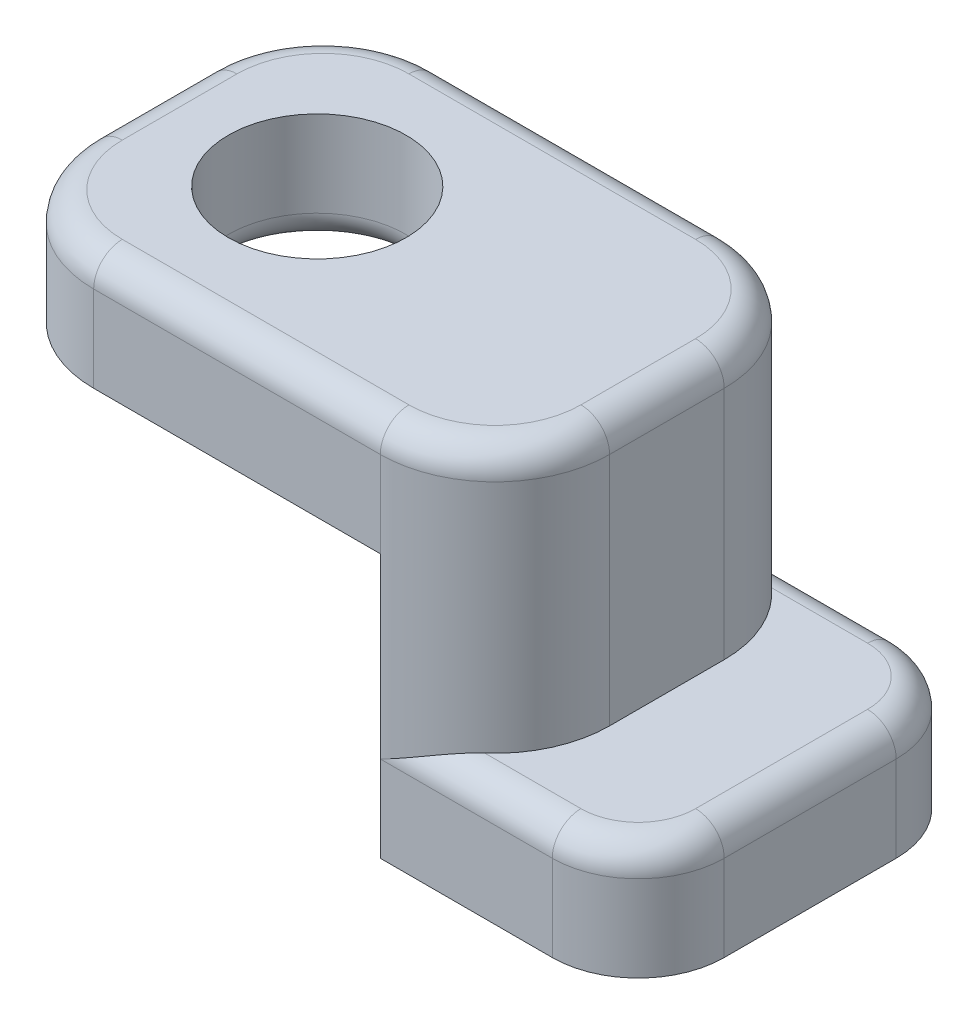
ISO-10303-21;
HEADER;
FILE_DESCRIPTION(('STEP AP214'),'2;1');
FILE_NAME('part.step','',(''),(''),'','','');
FILE_SCHEMA(('AUTOMOTIVE_DESIGN { 1 0 10303 214 1 1 1 1 }'));
ENDSEC;
DATA;
#1=APPLICATION_CONTEXT('core data for automotive mechanical design processes');
#2=APPLICATION_PROTOCOL_DEFINITION('international standard','automotive_design',2000,#1);
#3=PRODUCT_CONTEXT('',#1,'mechanical');
#4=PRODUCT('Part','Part','',(#3));
#5=PRODUCT_RELATED_PRODUCT_CATEGORY('part','',(#4));
#6=PRODUCT_DEFINITION_FORMATION('','',#4);
#7=PRODUCT_DEFINITION_CONTEXT('part definition',#1,'design');
#8=PRODUCT_DEFINITION('design','',#6,#7);
#9=PRODUCT_DEFINITION_SHAPE('','',#8);
#10=(LENGTH_UNIT() NAMED_UNIT(*) SI_UNIT(.MILLI.,.METRE.));
#11=(NAMED_UNIT(*) PLANE_ANGLE_UNIT() SI_UNIT($,.RADIAN.));
#12=(NAMED_UNIT(*) SI_UNIT($,.STERADIAN.) SOLID_ANGLE_UNIT());
#13=UNCERTAINTY_MEASURE_WITH_UNIT(LENGTH_MEASURE(1.E-05),#10,'distance_accuracy_value','');
#14=(GEOMETRIC_REPRESENTATION_CONTEXT(3) GLOBAL_UNCERTAINTY_ASSIGNED_CONTEXT((#13)) GLOBAL_UNIT_ASSIGNED_CONTEXT((#10,
#11,#12)) REPRESENTATION_CONTEXT('',''));
#15=CARTESIAN_POINT('',(0.,0.,0.));
#16=DIRECTION('',(0.,0.,1.));
#17=DIRECTION('',(1.,0.,0.));
#18=AXIS2_PLACEMENT_3D('',#15,#16,#17);
#19=CARTESIAN_POINT('',(2.5,2.,1.));
#20=DIRECTION('',(0.,-1.,0.));
#21=DIRECTION('',(0.,0.,-1.));
#22=AXIS2_PLACEMENT_3D('',#19,#20,#21);
#23=CYLINDRICAL_SURFACE('',#22,2.);
#24=DIRECTION('',(0.,-1.,0.));
#25=VECTOR('',#24,1.);
#26=CARTESIAN_POINT('',(4.5,2.,1.));
#27=LINE('',#26,#25);
#28=CARTESIAN_POINT('',(4.5,1.5,1.));
#29=VERTEX_POINT('',#28);
#30=CARTESIAN_POINT('',(4.5,-2.6,1.));
#31=VERTEX_POINT('',#30);
#32=EDGE_CURVE('E186',#29,#31,#27,.T.);
#33=ORIENTED_EDGE('',*,*,#32,.F.);
#34=CARTESIAN_POINT('',(2.5,1.5,1.));
#35=DIRECTION('',(0.,1.,0.));
#36=DIRECTION('',(0.,0.,1.));
#37=AXIS2_PLACEMENT_3D('',#34,#35,#36);
#38=CIRCLE('',#37,2.);
#39=CARTESIAN_POINT('',(2.5,1.5,3.));
#40=VERTEX_POINT('',#39);
#41=EDGE_CURVE('E295',#29,#40,#38,.F.);
#42=ORIENTED_EDGE('',*,*,#41,.T.);
#43=DIRECTION('',(0.,-1.,0.));
#44=VECTOR('',#43,1.);
#45=CARTESIAN_POINT('',(2.5,2.,3.));
#46=LINE('',#45,#44);
#47=CARTESIAN_POINT('',(2.5,0.,3.));
#48=VERTEX_POINT('',#47);
#49=EDGE_CURVE('E197',#40,#48,#46,.T.);
#50=ORIENTED_EDGE('',*,*,#49,.T.);
#51=DIRECTION('',(0.,1.,0.));
#52=VECTOR('',#51,1.);
#53=CARTESIAN_POINT('',(2.5,-4.6,3.));
#54=LINE('',#53,#52);
#55=CARTESIAN_POINT('',(2.5,-3.1,3.));
#56=VERTEX_POINT('',#55);
#57=EDGE_CURVE('E244',#56,#48,#54,.T.);
#58=ORIENTED_EDGE('',*,*,#57,.F.);
#59=CARTESIAN_POINT('',(3.82287565553229,-2.6,2.5));
#60=CARTESIAN_POINT('',(3.7984527541929,-2.60001041146748,2.52154355257096));
#61=CARTESIAN_POINT('',(3.77353061636778,-2.60139028328963,2.54245741418274));
#62=CARTESIAN_POINT('',(3.72289254665397,-2.60649832439411,2.58290199026406));
#63=CARTESIAN_POINT('',(3.69717822868773,-2.61022198524383,2.60243528029809));
#64=CARTESIAN_POINT('',(3.61944495996465,-2.6242553324765,2.65858499657073));
#65=CARTESIAN_POINT('',(3.56642280728998,-2.63744074350753,2.69311337358856));
#66=CARTESIAN_POINT('',(3.47062269700943,-2.66574389704176,2.74936132710876));
#67=CARTESIAN_POINT('',(3.42817149449629,-2.67978997791442,2.77222504946673));
#68=CARTESIAN_POINT('',(3.34248092653229,-2.71044334270582,2.81452696356911));
#69=CARTESIAN_POINT('',(3.29924124336696,-2.7270516801234,2.83396373921229));
#70=CARTESIAN_POINT('',(3.16825897389752,-2.77994999938814,2.8874197971662));
#71=CARTESIAN_POINT('',(3.07961086885532,-2.819197759605,2.916378213666));
#72=CARTESIAN_POINT('',(2.91050160700485,-2.89762139815224,2.95915616529427));
#73=CARTESIAN_POINT('',(2.83014737071499,-2.93638060742813,2.97423652527798));
#74=CARTESIAN_POINT('',(2.66917377258241,-3.01543353741682,2.99447592235285));
#75=CARTESIAN_POINT('',(2.58855573090319,-3.05572278625227,2.99966189728329));
#76=CARTESIAN_POINT('',(2.50533326775842,-3.09733336930444,2.9999946628835));
#77=CARTESIAN_POINT('',(2.50266659422678,-3.09866670626949,2.99999999557329));
#78=CARTESIAN_POINT('',(2.5,-3.1,3.));
#79=B_SPLINE_CURVE_WITH_KNOTS('',3,(#59,#60,#61,#62,#63,#64,#65,#66,#67,#68,#69,#70,#71,#72,#73,
#74,#75,#76,#77,#78),.UNSPECIFIED.,.F.,.F.,(4,2,2,2,2,2,2,2,2,4),(0.,0.0975966634311908,
0.19500616458057,0.388196470326694,0.53867609384178,0.689217754352703,0.99157284467503,
1.26249642313569,1.53268134341627,1.54162562963826),.UNSPECIFIED.);
#80=CARTESIAN_POINT('',(3.82287565553229,-2.6,2.5));
#81=VERTEX_POINT('',#80);
#82=EDGE_CURVE('E13',#56,#81,#79,.F.);
#83=ORIENTED_EDGE('',*,*,#82,.T.);
#84=CARTESIAN_POINT('',(2.5,-2.6,1.));
#85=DIRECTION('',(0.,1.,0.));
#86=DIRECTION('',(0.,0.,-1.));
#87=AXIS2_PLACEMENT_3D('',#84,#85,#86);
#88=CIRCLE('',#87,2.);
#89=EDGE_CURVE('E201',#81,#31,#88,.T.);
#90=ORIENTED_EDGE('',*,*,#89,.T.);
#91=EDGE_LOOP('',(#33,#42,#50,#58,#83,#90));
#92=FACE_BOUND('',#91,.T.);
#93=ADVANCED_FACE('F45',(#92),#23,.T.);
#94=CARTESIAN_POINT('',(4.5,2.,-1.));
#95=DIRECTION('',(-1.,0.,0.));
#96=DIRECTION('',(0.,0.,1.));
#97=AXIS2_PLACEMENT_3D('',#94,#95,#96);
#98=PLANE('',#97);
#99=DIRECTION('',(0.,-1.,0.));
#100=VECTOR('',#99,1.);
#101=CARTESIAN_POINT('',(4.5,2.,-1.));
#102=LINE('',#101,#100);
#103=CARTESIAN_POINT('',(4.5,1.5,-1.));
#104=VERTEX_POINT('',#103);
#105=CARTESIAN_POINT('',(4.5,-2.6,-1.));
#106=VERTEX_POINT('',#105);
#107=EDGE_CURVE('E198',#104,#106,#102,.T.);
#108=ORIENTED_EDGE('',*,*,#107,.F.);
#109=DIRECTION('',(0.,0.,-1.));
#110=VECTOR('',#109,1.);
#111=CARTESIAN_POINT('',(4.5,1.5,1.));
#112=LINE('',#111,#110);
#113=EDGE_CURVE('E193',#104,#29,#112,.F.);
#114=ORIENTED_EDGE('',*,*,#113,.T.);
#115=ORIENTED_EDGE('',*,*,#32,.T.);
#116=DIRECTION('',(0.,0.,-1.));
#117=VECTOR('',#116,1.);
#118=CARTESIAN_POINT('',(4.5,-2.6,1.));
#119=LINE('',#118,#117);
#120=EDGE_CURVE('E191',#31,#106,#119,.T.);
#121=ORIENTED_EDGE('',*,*,#120,.T.);
#122=EDGE_LOOP('',(#108,#114,#115,#121));
#123=FACE_BOUND('',#122,.T.);
#124=ADVANCED_FACE('F189',(#123),#98,.F.);
#125=CARTESIAN_POINT('',(2.5,2.,-1.));
#126=DIRECTION('',(0.,-1.,0.));
#127=DIRECTION('',(0.,0.,-1.));
#128=AXIS2_PLACEMENT_3D('',#125,#126,#127);
#129=CYLINDRICAL_SURFACE('',#128,2.);
#130=DIRECTION('',(0.,-1.,0.));
#131=VECTOR('',#130,1.);
#132=CARTESIAN_POINT('',(2.5,2.,-3.));
#133=LINE('',#132,#131);
#134=CARTESIAN_POINT('',(2.5,1.5,-3.));
#135=VERTEX_POINT('',#134);
#136=CARTESIAN_POINT('',(2.5,0.,-3.));
#137=VERTEX_POINT('',#136);
#138=EDGE_CURVE('E268',#135,#137,#133,.T.);
#139=ORIENTED_EDGE('',*,*,#138,.F.);
#140=CARTESIAN_POINT('',(2.5,1.5,-1.));
#141=DIRECTION('',(0.,1.,0.));
#142=DIRECTION('',(0.,0.,1.));
#143=AXIS2_PLACEMENT_3D('',#140,#141,#142);
#144=CIRCLE('',#143,2.);
#145=EDGE_CURVE('E307',#135,#104,#144,.F.);
#146=ORIENTED_EDGE('',*,*,#145,.T.);
#147=ORIENTED_EDGE('',*,*,#107,.T.);
#148=CARTESIAN_POINT('',(2.5,-2.6,-1.));
#149=DIRECTION('',(0.,1.,0.));
#150=DIRECTION('',(0.,0.,-1.));
#151=AXIS2_PLACEMENT_3D('',#148,#149,#150);
#152=CIRCLE('',#151,2.);
#153=CARTESIAN_POINT('',(3.82287565553229,-2.6,-2.5));
#154=VERTEX_POINT('',#153);
#155=EDGE_CURVE('E206',#106,#154,#152,.T.);
#156=ORIENTED_EDGE('',*,*,#155,.T.);
#157=CARTESIAN_POINT('',(3.82287565553229,-2.6,-2.5));
#158=CARTESIAN_POINT('',(3.7984527541929,-2.60001041146748,-2.52154355257096));
#159=CARTESIAN_POINT('',(3.77353061636778,-2.60139028328963,-2.54245741418274));
#160=CARTESIAN_POINT('',(3.72289254665397,-2.60649832439411,-2.58290199026406));
#161=CARTESIAN_POINT('',(3.69717822868772,-2.61022198524383,-2.6024352802981));
#162=CARTESIAN_POINT('',(3.61944495996465,-2.62425533247651,-2.65858499657073));
#163=CARTESIAN_POINT('',(3.56642280728998,-2.63744074350754,-2.69311337358856));
#164=CARTESIAN_POINT('',(3.47062269700943,-2.66574389704176,-2.74936132710876));
#165=CARTESIAN_POINT('',(3.42817149449629,-2.67978997791442,-2.77222504946673));
#166=CARTESIAN_POINT('',(3.34248092653229,-2.71044334270582,-2.81452696356911));
#167=CARTESIAN_POINT('',(3.29924124336696,-2.7270516801234,-2.83396373921229));
#168=CARTESIAN_POINT('',(3.16825897389752,-2.77994999938814,-2.8874197971662));
#169=CARTESIAN_POINT('',(3.07961086885531,-2.81919775960498,-2.916378213666));
#170=CARTESIAN_POINT('',(2.91050160700485,-2.89762139815225,-2.95915616529427));
#171=CARTESIAN_POINT('',(2.830147370715,-2.93638060742817,-2.97423652527798));
#172=CARTESIAN_POINT('',(2.66917377258239,-3.01543353741678,-2.99447592235285));
#173=CARTESIAN_POINT('',(2.58855573090311,-3.05572278625213,-2.99966189728329));
#174=CARTESIAN_POINT('',(2.50533326775842,-3.09733336930443,-2.9999946628835));
#175=CARTESIAN_POINT('',(2.50266659422678,-3.09866670626949,-2.99999999557329));
#176=CARTESIAN_POINT('',(2.5,-3.1,-3.));
#177=B_SPLINE_CURVE_WITH_KNOTS('',3,(#157,#158,#159,#160,#161,#162,#163,#164,#165,#166,#167,
#168,#169,#170,#171,#172,#173,#174,#175,#176),.UNSPECIFIED.,.F.,.F.,(4,2,2,2,2,2,2,2,2,4),(0.,
0.0975966634311933,0.195006164580576,0.388196470326695,0.538676093841779,0.689217754352701,
0.991572844675033,1.26249642313569,1.53268134341627,1.54162562963826),.UNSPECIFIED.);
#178=CARTESIAN_POINT('',(2.5,-3.1,-3.));
#179=VERTEX_POINT('',#178);
#180=EDGE_CURVE('E55',#154,#179,#177,.T.);
#181=ORIENTED_EDGE('',*,*,#180,.T.);
#182=DIRECTION('',(0.,1.,0.));
#183=VECTOR('',#182,1.);
#184=CARTESIAN_POINT('',(2.5,-4.6,-3.));
#185=LINE('',#184,#183);
#186=EDGE_CURVE('E63',#179,#137,#185,.T.);
#187=ORIENTED_EDGE('',*,*,#186,.T.);
#188=EDGE_LOOP('',(#139,#146,#147,#156,#181,#187));
#189=FACE_BOUND('',#188,.T.);
#190=ADVANCED_FACE('F351',(#189),#129,.T.);
#191=CARTESIAN_POINT('',(-2.5,0.,-0.999999999999999));
#192=DIRECTION('',(0.,1.,0.));
#193=DIRECTION('',(0.,0.,1.));
#194=AXIS2_PLACEMENT_3D('',#191,#192,#193);
#195=PLANE('',#194);
#196=CARTESIAN_POINT('',(-1.6,0.,0.));
#197=DIRECTION('',(0.,1.,0.));
#198=DIRECTION('',(0.,0.,1.));
#199=AXIS2_PLACEMENT_3D('',#196,#197,#198);
#200=CIRCLE('',#199,2.05);
#201=CARTESIAN_POINT('',(-1.6,0.,2.05));
#202=VERTEX_POINT('',#201);
#203=EDGE_CURVE('E329',#202,#202,#200,.T.);
#204=ORIENTED_EDGE('',*,*,#203,.T.);
#205=EDGE_LOOP('',(#204));
#206=FACE_BOUND('',#205,.T.);
#207=DIRECTION('',(0.,0.,-1.));
#208=VECTOR('',#207,1.);
#209=CARTESIAN_POINT('',(2.5,0.,3.));
#210=LINE('',#209,#208);
#211=EDGE_CURVE('E234',#48,#137,#210,.T.);
#212=ORIENTED_EDGE('',*,*,#211,.F.);
#213=DIRECTION('',(1.,0.,0.));
#214=VECTOR('',#213,1.);
#215=CARTESIAN_POINT('',(2.5,0.,3.));
#216=LINE('',#215,#214);
#217=CARTESIAN_POINT('',(-2.5,0.,3.));
#218=VERTEX_POINT('',#217);
#219=EDGE_CURVE('E260',#218,#48,#216,.T.);
#220=ORIENTED_EDGE('',*,*,#219,.F.);
#221=CARTESIAN_POINT('',(-2.5,0.,1.));
#222=DIRECTION('',(0.,1.,0.));
#223=DIRECTION('',(0.,0.,-1.));
#224=AXIS2_PLACEMENT_3D('',#221,#222,#223);
#225=CIRCLE('',#224,2.);
#226=CARTESIAN_POINT('',(-4.5,0.,1.));
#227=VERTEX_POINT('',#226);
#228=EDGE_CURVE('E257',#227,#218,#225,.T.);
#229=ORIENTED_EDGE('',*,*,#228,.F.);
#230=DIRECTION('',(0.,0.,1.));
#231=VECTOR('',#230,1.);
#232=CARTESIAN_POINT('',(-4.5,0.,-0.999999999999999));
#233=LINE('',#232,#231);
#234=CARTESIAN_POINT('',(-4.5,0.,-0.999999999999999));
#235=VERTEX_POINT('',#234);
#236=EDGE_CURVE('E254',#235,#227,#233,.T.);
#237=ORIENTED_EDGE('',*,*,#236,.F.);
#238=CARTESIAN_POINT('',(-2.5,0.,-0.999999999999999));
#239=DIRECTION('',(0.,1.,0.));
#240=DIRECTION('',(0.,0.,1.));
#241=AXIS2_PLACEMENT_3D('',#238,#239,#240);
#242=CIRCLE('',#241,2.);
#243=CARTESIAN_POINT('',(-2.5,0.,-3.));
#244=VERTEX_POINT('',#243);
#245=EDGE_CURVE('E251',#244,#235,#242,.T.);
#246=ORIENTED_EDGE('',*,*,#245,.F.);
#247=DIRECTION('',(-1.,0.,0.));
#248=VECTOR('',#247,1.);
#249=CARTESIAN_POINT('',(2.5,0.,-3.));
#250=LINE('',#249,#248);
#251=EDGE_CURVE('E263',#137,#244,#250,.T.);
#252=ORIENTED_EDGE('',*,*,#251,.F.);
#253=EDGE_LOOP('',(#212,#220,#229,#237,#246,#252));
#254=FACE_BOUND('',#253,.T.);
#255=ADVANCED_FACE('F406',(#206,#254),#195,.F.);
#256=CARTESIAN_POINT('',(-2.5,2.,-0.999999999999999));
#257=DIRECTION('',(0.,-1.,0.));
#258=DIRECTION('',(0.,0.,-1.));
#259=AXIS2_PLACEMENT_3D('',#256,#257,#258);
#260=CYLINDRICAL_SURFACE('',#259,2.);
#261=DIRECTION('',(0.,-1.,0.));
#262=VECTOR('',#261,1.);
#263=CARTESIAN_POINT('',(-4.5,2.,-0.999999999999999));
#264=LINE('',#263,#262);
#265=CARTESIAN_POINT('',(-4.5,1.5,-0.999999999999999));
#266=VERTEX_POINT('',#265);
#267=EDGE_CURVE('E276',#266,#235,#264,.T.);
#268=ORIENTED_EDGE('',*,*,#267,.F.);
#269=CARTESIAN_POINT('',(-2.5,1.5,-0.999999999999999));
#270=DIRECTION('',(0.,1.,0.));
#271=DIRECTION('',(0.,0.,1.));
#272=AXIS2_PLACEMENT_3D('',#269,#270,#271);
#273=CIRCLE('',#272,2.);
#274=CARTESIAN_POINT('',(-2.5,1.5,-3.));
#275=VERTEX_POINT('',#274);
#276=EDGE_CURVE('E303',#266,#275,#273,.F.);
#277=ORIENTED_EDGE('',*,*,#276,.T.);
#278=DIRECTION('',(0.,-1.,0.));
#279=VECTOR('',#278,1.);
#280=CARTESIAN_POINT('',(-2.5,2.,-3.));
#281=LINE('',#280,#279);
#282=EDGE_CURVE('E266',#275,#244,#281,.T.);
#283=ORIENTED_EDGE('',*,*,#282,.T.);
#284=ORIENTED_EDGE('',*,*,#245,.T.);
#285=EDGE_LOOP('',(#268,#277,#283,#284));
#286=FACE_BOUND('',#285,.T.);
#287=ADVANCED_FACE('F403',(#286),#260,.T.);
#288=CARTESIAN_POINT('',(-4.5,2.,-0.999999999999999));
#289=DIRECTION('',(1.,0.,0.));
#290=DIRECTION('',(0.,0.,-1.));
#291=AXIS2_PLACEMENT_3D('',#288,#289,#290);
#292=PLANE('',#291);
#293=DIRECTION('',(0.,-1.,0.));
#294=VECTOR('',#293,1.);
#295=CARTESIAN_POINT('',(-4.5,2.,1.));
#296=LINE('',#295,#294);
#297=CARTESIAN_POINT('',(-4.5,1.5,1.));
#298=VERTEX_POINT('',#297);
#299=EDGE_CURVE('E274',#298,#227,#296,.T.);
#300=ORIENTED_EDGE('',*,*,#299,.F.);
#301=DIRECTION('',(0.,0.,1.));
#302=VECTOR('',#301,1.);
#303=CARTESIAN_POINT('',(-4.5,1.5,-0.999999999999999));
#304=LINE('',#303,#302);
#305=EDGE_CURVE('E301',#298,#266,#304,.F.);
#306=ORIENTED_EDGE('',*,*,#305,.T.);
#307=ORIENTED_EDGE('',*,*,#267,.T.);
#308=ORIENTED_EDGE('',*,*,#236,.T.);
#309=EDGE_LOOP('',(#300,#306,#307,#308));
#310=FACE_BOUND('',#309,.T.);
#311=ADVANCED_FACE('F399',(#310),#292,.F.);
#312=CARTESIAN_POINT('',(-2.5,2.,1.));
#313=DIRECTION('',(0.,-1.,0.));
#314=DIRECTION('',(0.,0.,-1.));
#315=AXIS2_PLACEMENT_3D('',#312,#313,#314);
#316=CYLINDRICAL_SURFACE('',#315,2.);
#317=DIRECTION('',(0.,-1.,0.));
#318=VECTOR('',#317,1.);
#319=CARTESIAN_POINT('',(-2.5,2.,3.));
#320=LINE('',#319,#318);
#321=CARTESIAN_POINT('',(-2.5,1.5,3.));
#322=VERTEX_POINT('',#321);
#323=EDGE_CURVE('E272',#322,#218,#320,.T.);
#324=ORIENTED_EDGE('',*,*,#323,.F.);
#325=CARTESIAN_POINT('',(-2.5,1.5,1.));
#326=DIRECTION('',(0.,1.,0.));
#327=DIRECTION('',(0.,0.,1.));
#328=AXIS2_PLACEMENT_3D('',#325,#326,#327);
#329=CIRCLE('',#328,2.);
#330=EDGE_CURVE('E299',#322,#298,#329,.F.);
#331=ORIENTED_EDGE('',*,*,#330,.T.);
#332=ORIENTED_EDGE('',*,*,#299,.T.);
#333=ORIENTED_EDGE('',*,*,#228,.T.);
#334=EDGE_LOOP('',(#324,#331,#332,#333));
#335=FACE_BOUND('',#334,.T.);
#336=ADVANCED_FACE('F395',(#335),#316,.T.);
#337=CARTESIAN_POINT('',(2.5,2.,3.));
#338=DIRECTION('',(0.,0.,-1.));
#339=DIRECTION('',(-1.,0.,0.));
#340=AXIS2_PLACEMENT_3D('',#337,#338,#339);
#341=PLANE('',#340);
#342=ORIENTED_EDGE('',*,*,#49,.F.);
#343=DIRECTION('',(1.,0.,0.));
#344=VECTOR('',#343,1.);
#345=CARTESIAN_POINT('',(-2.5,1.5,3.));
#346=LINE('',#345,#344);
#347=EDGE_CURVE('E297',#40,#322,#346,.F.);
#348=ORIENTED_EDGE('',*,*,#347,.T.);
#349=ORIENTED_EDGE('',*,*,#323,.T.);
#350=ORIENTED_EDGE('',*,*,#219,.T.);
#351=EDGE_LOOP('',(#342,#348,#349,#350));
#352=FACE_BOUND('',#351,.T.);
#353=ADVANCED_FACE('F391',(#352),#341,.F.);
#354=CARTESIAN_POINT('',(2.5,2.,-3.));
#355=DIRECTION('',(0.,0.,1.));
#356=DIRECTION('',(1.,0.,0.));
#357=AXIS2_PLACEMENT_3D('',#354,#355,#356);
#358=PLANE('',#357);
#359=ORIENTED_EDGE('',*,*,#282,.F.);
#360=DIRECTION('',(-1.,0.,0.));
#361=VECTOR('',#360,1.);
#362=CARTESIAN_POINT('',(2.5,1.5,-3.));
#363=LINE('',#362,#361);
#364=EDGE_CURVE('E305',#275,#135,#363,.F.);
#365=ORIENTED_EDGE('',*,*,#364,.T.);
#366=ORIENTED_EDGE('',*,*,#138,.T.);
#367=ORIENTED_EDGE('',*,*,#251,.T.);
#368=EDGE_LOOP('',(#359,#365,#366,#367));
#369=FACE_BOUND('',#368,.T.);
#370=ADVANCED_FACE('F394',(#369),#358,.F.);
#371=CARTESIAN_POINT('',(-2.5,2.,-0.999999999999999));
#372=DIRECTION('',(0.,1.,0.));
#373=DIRECTION('',(0.,0.,1.));
#374=AXIS2_PLACEMENT_3D('',#371,#372,#373);
#375=PLANE('',#374);
#376=DIRECTION('',(1.,0.,0.));
#377=VECTOR('',#376,1.);
#378=CARTESIAN_POINT('',(2.5,2.,2.5));
#379=LINE('',#378,#377);
#380=CARTESIAN_POINT('',(-2.5,2.,2.5));
#381=VERTEX_POINT('',#380);
#382=CARTESIAN_POINT('',(2.5,2.,2.5));
#383=VERTEX_POINT('',#382);
#384=EDGE_CURVE('E290',#381,#383,#379,.T.);
#385=ORIENTED_EDGE('',*,*,#384,.T.);
#386=CARTESIAN_POINT('',(2.5,2.,1.));
#387=DIRECTION('',(0.,1.,0.));
#388=DIRECTION('',(0.,0.,1.));
#389=AXIS2_PLACEMENT_3D('',#386,#387,#388);
#390=CIRCLE('',#389,1.5);
#391=CARTESIAN_POINT('',(4.,2.,1.));
#392=VERTEX_POINT('',#391);
#393=EDGE_CURVE('E292',#383,#392,#390,.T.);
#394=ORIENTED_EDGE('',*,*,#393,.T.);
#395=DIRECTION('',(0.,0.,-1.));
#396=VECTOR('',#395,1.);
#397=CARTESIAN_POINT('',(4.,2.,-1.));
#398=LINE('',#397,#396);
#399=CARTESIAN_POINT('',(4.,2.,-1.));
#400=VERTEX_POINT('',#399);
#401=EDGE_CURVE('E278',#392,#400,#398,.T.);
#402=ORIENTED_EDGE('',*,*,#401,.T.);
#403=CARTESIAN_POINT('',(2.5,2.,-1.));
#404=DIRECTION('',(0.,1.,0.));
#405=DIRECTION('',(0.,0.,1.));
#406=AXIS2_PLACEMENT_3D('',#403,#404,#405);
#407=CIRCLE('',#406,1.5);
#408=CARTESIAN_POINT('',(2.5,2.,-2.5));
#409=VERTEX_POINT('',#408);
#410=EDGE_CURVE('E280',#400,#409,#407,.T.);
#411=ORIENTED_EDGE('',*,*,#410,.T.);
#412=DIRECTION('',(-1.,0.,0.));
#413=VECTOR('',#412,1.);
#414=CARTESIAN_POINT('',(-2.5,2.,-2.5));
#415=LINE('',#414,#413);
#416=CARTESIAN_POINT('',(-2.5,2.,-2.5));
#417=VERTEX_POINT('',#416);
#418=EDGE_CURVE('E282',#409,#417,#415,.T.);
#419=ORIENTED_EDGE('',*,*,#418,.T.);
#420=CARTESIAN_POINT('',(-2.5,2.,-0.999999999999999));
#421=DIRECTION('',(0.,1.,0.));
#422=DIRECTION('',(0.,0.,1.));
#423=AXIS2_PLACEMENT_3D('',#420,#421,#422);
#424=CIRCLE('',#423,1.5);
#425=CARTESIAN_POINT('',(-4.,2.,-0.999999999999999));
#426=VERTEX_POINT('',#425);
#427=EDGE_CURVE('E284',#417,#426,#424,.T.);
#428=ORIENTED_EDGE('',*,*,#427,.T.);
#429=DIRECTION('',(0.,0.,1.));
#430=VECTOR('',#429,1.);
#431=CARTESIAN_POINT('',(-4.,2.,1.));
#432=LINE('',#431,#430);
#433=CARTESIAN_POINT('',(-4.,2.,1.));
#434=VERTEX_POINT('',#433);
#435=EDGE_CURVE('E286',#426,#434,#432,.T.);
#436=ORIENTED_EDGE('',*,*,#435,.T.);
#437=CARTESIAN_POINT('',(-2.5,2.,1.));
#438=DIRECTION('',(0.,1.,0.));
#439=DIRECTION('',(0.,0.,1.));
#440=AXIS2_PLACEMENT_3D('',#437,#438,#439);
#441=CIRCLE('',#440,1.5);
#442=EDGE_CURVE('E288',#434,#381,#441,.T.);
#443=ORIENTED_EDGE('',*,*,#442,.T.);
#444=EDGE_LOOP('',(#385,#394,#402,#411,#419,#428,#436,#443));
#445=FACE_BOUND('',#444,.T.);
#446=CARTESIAN_POINT('',(-1.6,2.,0.));
#447=DIRECTION('',(0.,1.,0.));
#448=DIRECTION('',(0.,0.,1.));
#449=AXIS2_PLACEMENT_3D('',#446,#447,#448);
#450=CIRCLE('',#449,1.55);
#451=CARTESIAN_POINT('',(-1.6,2.,1.55));
#452=VERTEX_POINT('',#451);
#453=EDGE_CURVE('E248',#452,#452,#450,.T.);
#454=ORIENTED_EDGE('',*,*,#453,.F.);
#455=EDGE_LOOP('',(#454));
#456=FACE_BOUND('',#455,.T.);
#457=ADVANCED_FACE('F482',(#445,#456),#375,.T.);
#458=CARTESIAN_POINT('',(-1.6,0.,0.));
#459=DIRECTION('',(0.,1.,0.));
#460=DIRECTION('',(0.,0.,1.));
#461=AXIS2_PLACEMENT_3D('',#458,#459,#460);
#462=CYLINDRICAL_SURFACE('',#461,1.55);
#463=CARTESIAN_POINT('',(-1.6,0.5,0.));
#464=DIRECTION('',(0.,1.,0.));
#465=DIRECTION('',(0.,0.,1.));
#466=AXIS2_PLACEMENT_3D('',#463,#464,#465);
#467=CIRCLE('',#466,1.55);
#468=CARTESIAN_POINT('',(-1.6,0.5,1.55));
#469=VERTEX_POINT('',#468);
#470=EDGE_CURVE('E332',#469,#469,#467,.F.);
#471=ORIENTED_EDGE('',*,*,#470,.T.);
#472=EDGE_LOOP('',(#471));
#473=FACE_BOUND('',#472,.T.);
#474=ORIENTED_EDGE('',*,*,#453,.T.);
#475=EDGE_LOOP('',(#474));
#476=FACE_BOUND('',#475,.T.);
#477=ADVANCED_FACE('F549',(#473,#476),#462,.F.);
#478=CARTESIAN_POINT('',(2.5,-4.6,3.));
#479=DIRECTION('',(1.,0.,0.));
#480=DIRECTION('',(0.,0.,-1.));
#481=AXIS2_PLACEMENT_3D('',#478,#479,#480);
#482=PLANE('',#481);
#483=ORIENTED_EDGE('',*,*,#211,.T.);
#484=ORIENTED_EDGE('',*,*,#186,.F.);
#485=CARTESIAN_POINT('',(2.5,-4.6,-3.));
#486=VERTEX_POINT('',#485);
#487=EDGE_CURVE('E242',#486,#179,#185,.T.);
#488=ORIENTED_EDGE('',*,*,#487,.F.);
#489=DIRECTION('',(0.,0.,-1.));
#490=VECTOR('',#489,1.);
#491=CARTESIAN_POINT('',(2.5,-4.6,3.));
#492=LINE('',#491,#490);
#493=CARTESIAN_POINT('',(2.5,-4.6,3.));
#494=VERTEX_POINT('',#493);
#495=EDGE_CURVE('E238',#494,#486,#492,.T.);
#496=ORIENTED_EDGE('',*,*,#495,.F.);
#497=EDGE_CURVE('E245',#494,#56,#54,.T.);
#498=ORIENTED_EDGE('',*,*,#497,.T.);
#499=ORIENTED_EDGE('',*,*,#57,.T.);
#500=EDGE_LOOP('',(#483,#484,#488,#496,#498,#499));
#501=FACE_BOUND('',#500,.T.);
#502=ADVANCED_FACE('F503',(#501),#482,.F.);
#503=CARTESIAN_POINT('',(2.5,-4.6,-1.));
#504=DIRECTION('',(0.,-1.,0.));
#505=DIRECTION('',(0.,0.,-1.));
#506=AXIS2_PLACEMENT_3D('',#503,#504,#505);
#507=PLANE('',#506);
#508=ORIENTED_EDGE('',*,*,#495,.T.);
#509=DIRECTION('',(1.,0.,0.));
#510=VECTOR('',#509,1.);
#511=CARTESIAN_POINT('',(5.5,-4.6,-3.));
#512=LINE('',#511,#510);
#513=CARTESIAN_POINT('',(5.5,-4.6,-3.));
#514=VERTEX_POINT('',#513);
#515=EDGE_CURVE('E217',#486,#514,#512,.T.);
#516=ORIENTED_EDGE('',*,*,#515,.T.);
#517=CARTESIAN_POINT('',(5.5,-4.6,-1.5));
#518=DIRECTION('',(0.,-1.,0.));
#519=DIRECTION('',(0.,0.,1.));
#520=AXIS2_PLACEMENT_3D('',#517,#518,#519);
#521=CIRCLE('',#520,1.5);
#522=CARTESIAN_POINT('',(7.,-4.6,-1.5));
#523=VERTEX_POINT('',#522);
#524=EDGE_CURVE('E220',#514,#523,#521,.T.);
#525=ORIENTED_EDGE('',*,*,#524,.T.);
#526=DIRECTION('',(0.,0.,1.));
#527=VECTOR('',#526,1.);
#528=CARTESIAN_POINT('',(7.,-4.6,1.5));
#529=LINE('',#528,#527);
#530=CARTESIAN_POINT('',(7.,-4.6,1.5));
#531=VERTEX_POINT('',#530);
#532=EDGE_CURVE('E224',#523,#531,#529,.T.);
#533=ORIENTED_EDGE('',*,*,#532,.T.);
#534=CARTESIAN_POINT('',(5.5,-4.6,1.5));
#535=DIRECTION('',(0.,-1.,0.));
#536=DIRECTION('',(0.,0.,1.));
#537=AXIS2_PLACEMENT_3D('',#534,#535,#536);
#538=CIRCLE('',#537,1.5);
#539=CARTESIAN_POINT('',(5.5,-4.6,3.));
#540=VERTEX_POINT('',#539);
#541=EDGE_CURVE('E227',#531,#540,#538,.T.);
#542=ORIENTED_EDGE('',*,*,#541,.T.);
#543=DIRECTION('',(-1.,0.,0.));
#544=VECTOR('',#543,1.);
#545=CARTESIAN_POINT('',(2.5,-4.6,3.));
#546=LINE('',#545,#544);
#547=EDGE_CURVE('E230',#540,#494,#546,.T.);
#548=ORIENTED_EDGE('',*,*,#547,.T.);
#549=EDGE_LOOP('',(#508,#516,#525,#533,#542,#548));
#550=FACE_BOUND('',#549,.T.);
#551=ADVANCED_FACE('F526',(#550),#507,.T.);
#552=CARTESIAN_POINT('',(2.5,-2.6,3.));
#553=DIRECTION('',(0.,0.,1.));
#554=DIRECTION('',(1.,0.,0.));
#555=AXIS2_PLACEMENT_3D('',#552,#553,#554);
#556=PLANE('',#555);
#557=DIRECTION('',(0.,-1.,0.));
#558=VECTOR('',#557,1.);
#559=CARTESIAN_POINT('',(5.5,-2.6,3.));
#560=LINE('',#559,#558);
#561=CARTESIAN_POINT('',(5.5,-3.1,3.));
#562=VERTEX_POINT('',#561);
#563=EDGE_CURVE('E232',#562,#540,#560,.T.);
#564=ORIENTED_EDGE('',*,*,#563,.F.);
#565=DIRECTION('',(-1.,0.,0.));
#566=VECTOR('',#565,1.);
#567=CARTESIAN_POINT('',(2.5,-3.1,3.));
#568=LINE('',#567,#566);
#569=EDGE_CURVE('E324',#562,#56,#568,.T.);
#570=ORIENTED_EDGE('',*,*,#569,.T.);
#571=ORIENTED_EDGE('',*,*,#497,.F.);
#572=ORIENTED_EDGE('',*,*,#547,.F.);
#573=EDGE_LOOP('',(#564,#570,#571,#572));
#574=FACE_BOUND('',#573,.T.);
#575=ADVANCED_FACE('F510',(#574),#556,.T.);
#576=CARTESIAN_POINT('',(5.5,-2.6,1.5));
#577=DIRECTION('',(0.,-1.,0.));
#578=DIRECTION('',(0.,0.,-1.));
#579=AXIS2_PLACEMENT_3D('',#576,#577,#578);
#580=CYLINDRICAL_SURFACE('',#579,1.5);
#581=DIRECTION('',(0.,-1.,0.));
#582=VECTOR('',#581,1.);
#583=CARTESIAN_POINT('',(7.,-2.6,1.5));
#584=LINE('',#583,#582);
#585=CARTESIAN_POINT('',(7.,-3.1,1.5));
#586=VERTEX_POINT('',#585);
#587=EDGE_CURVE('E235',#586,#531,#584,.T.);
#588=ORIENTED_EDGE('',*,*,#587,.F.);
#589=CARTESIAN_POINT('',(5.5,-3.1,1.5));
#590=DIRECTION('',(0.,-1.,0.));
#591=DIRECTION('',(0.,0.,-1.));
#592=AXIS2_PLACEMENT_3D('',#589,#590,#591);
#593=CIRCLE('',#592,1.5);
#594=EDGE_CURVE('E327',#586,#562,#593,.T.);
#595=ORIENTED_EDGE('',*,*,#594,.T.);
#596=ORIENTED_EDGE('',*,*,#563,.T.);
#597=ORIENTED_EDGE('',*,*,#541,.F.);
#598=EDGE_LOOP('',(#588,#595,#596,#597));
#599=FACE_BOUND('',#598,.T.);
#600=ADVANCED_FACE('F530',(#599),#580,.T.);
#601=CARTESIAN_POINT('',(7.,-2.6,1.5));
#602=DIRECTION('',(1.,0.,0.));
#603=DIRECTION('',(0.,0.,-1.));
#604=AXIS2_PLACEMENT_3D('',#601,#602,#603);
#605=PLANE('',#604);
#606=DIRECTION('',(0.,-1.,0.));
#607=VECTOR('',#606,1.);
#608=CARTESIAN_POINT('',(7.,-2.6,-1.5));
#609=LINE('',#608,#607);
#610=CARTESIAN_POINT('',(7.,-3.1,-1.5));
#611=VERTEX_POINT('',#610);
#612=EDGE_CURVE('E213',#611,#523,#609,.T.);
#613=ORIENTED_EDGE('',*,*,#612,.F.);
#614=DIRECTION('',(0.,0.,1.));
#615=VECTOR('',#614,1.);
#616=CARTESIAN_POINT('',(7.,-3.1,1.5));
#617=LINE('',#616,#615);
#618=EDGE_CURVE('E336',#611,#586,#617,.T.);
#619=ORIENTED_EDGE('',*,*,#618,.T.);
#620=ORIENTED_EDGE('',*,*,#587,.T.);
#621=ORIENTED_EDGE('',*,*,#532,.F.);
#622=EDGE_LOOP('',(#613,#619,#620,#621));
#623=FACE_BOUND('',#622,.T.);
#624=ADVANCED_FACE('F532',(#623),#605,.T.);
#625=CARTESIAN_POINT('',(5.5,-2.6,-1.5));
#626=DIRECTION('',(0.,-1.,0.));
#627=DIRECTION('',(0.,0.,-1.));
#628=AXIS2_PLACEMENT_3D('',#625,#626,#627);
#629=CYLINDRICAL_SURFACE('',#628,1.5);
#630=DIRECTION('',(0.,-1.,0.));
#631=VECTOR('',#630,1.);
#632=CARTESIAN_POINT('',(5.5,-2.6,-3.));
#633=LINE('',#632,#631);
#634=CARTESIAN_POINT('',(5.5,-3.1,-3.));
#635=VERTEX_POINT('',#634);
#636=EDGE_CURVE('E211',#635,#514,#633,.T.);
#637=ORIENTED_EDGE('',*,*,#636,.F.);
#638=CARTESIAN_POINT('',(5.5,-3.1,-1.5));
#639=DIRECTION('',(0.,-1.,0.));
#640=DIRECTION('',(0.,0.,-1.));
#641=AXIS2_PLACEMENT_3D('',#638,#639,#640);
#642=CIRCLE('',#641,1.5);
#643=EDGE_CURVE('E322',#635,#611,#642,.T.);
#644=ORIENTED_EDGE('',*,*,#643,.T.);
#645=ORIENTED_EDGE('',*,*,#612,.T.);
#646=ORIENTED_EDGE('',*,*,#524,.F.);
#647=EDGE_LOOP('',(#637,#644,#645,#646));
#648=FACE_BOUND('',#647,.T.);
#649=ADVANCED_FACE('F522',(#648),#629,.T.);
#650=CARTESIAN_POINT('',(5.5,-2.6,-3.));
#651=DIRECTION('',(0.,0.,-1.));
#652=DIRECTION('',(-1.,0.,0.));
#653=AXIS2_PLACEMENT_3D('',#650,#651,#652);
#654=PLANE('',#653);
#655=ORIENTED_EDGE('',*,*,#487,.T.);
#656=DIRECTION('',(1.,0.,0.));
#657=VECTOR('',#656,1.);
#658=CARTESIAN_POINT('',(5.5,-3.1,-3.));
#659=LINE('',#658,#657);
#660=EDGE_CURVE('E309',#179,#635,#659,.T.);
#661=ORIENTED_EDGE('',*,*,#660,.T.);
#662=ORIENTED_EDGE('',*,*,#636,.T.);
#663=ORIENTED_EDGE('',*,*,#515,.F.);
#664=EDGE_LOOP('',(#655,#661,#662,#663));
#665=FACE_BOUND('',#664,.T.);
#666=ADVANCED_FACE('F519',(#665),#654,.T.);
#667=CARTESIAN_POINT('',(2.5,-2.6,-1.));
#668=DIRECTION('',(0.,-1.,0.));
#669=DIRECTION('',(0.,0.,-1.));
#670=AXIS2_PLACEMENT_3D('',#667,#668,#669);
#671=PLANE('',#670);
#672=CARTESIAN_POINT('',(5.5,-2.6,-1.5));
#673=DIRECTION('',(0.,-1.,0.));
#674=DIRECTION('',(0.,0.,-1.));
#675=AXIS2_PLACEMENT_3D('',#672,#673,#674);
#676=CIRCLE('',#675,1.);
#677=CARTESIAN_POINT('',(6.5,-2.6,-1.5));
#678=VERTEX_POINT('',#677);
#679=CARTESIAN_POINT('',(5.5,-2.6,-2.5));
#680=VERTEX_POINT('',#679);
#681=EDGE_CURVE('E318',#678,#680,#676,.F.);
#682=ORIENTED_EDGE('',*,*,#681,.T.);
#683=DIRECTION('',(1.,0.,0.));
#684=VECTOR('',#683,1.);
#685=CARTESIAN_POINT('',(2.5,-2.6,-2.5));
#686=LINE('',#685,#684);
#687=EDGE_CURVE('E320',#680,#154,#686,.F.);
#688=ORIENTED_EDGE('',*,*,#687,.T.);
#689=ORIENTED_EDGE('',*,*,#155,.F.);
#690=ORIENTED_EDGE('',*,*,#120,.F.);
#691=ORIENTED_EDGE('',*,*,#89,.F.);
#692=DIRECTION('',(-1.,0.,0.));
#693=VECTOR('',#692,1.);
#694=CARTESIAN_POINT('',(5.5,-2.6,2.5));
#695=LINE('',#694,#693);
#696=CARTESIAN_POINT('',(5.5,-2.6,2.5));
#697=VERTEX_POINT('',#696);
#698=EDGE_CURVE('E316',#81,#697,#695,.F.);
#699=ORIENTED_EDGE('',*,*,#698,.T.);
#700=CARTESIAN_POINT('',(5.5,-2.6,1.5));
#701=DIRECTION('',(0.,-1.,0.));
#702=DIRECTION('',(0.,0.,-1.));
#703=AXIS2_PLACEMENT_3D('',#700,#701,#702);
#704=CIRCLE('',#703,1.);
#705=CARTESIAN_POINT('',(6.5,-2.6,1.5));
#706=VERTEX_POINT('',#705);
#707=EDGE_CURVE('E314',#697,#706,#704,.F.);
#708=ORIENTED_EDGE('',*,*,#707,.T.);
#709=DIRECTION('',(0.,0.,1.));
#710=VECTOR('',#709,1.);
#711=CARTESIAN_POINT('',(6.5,-2.6,-1.5));
#712=LINE('',#711,#710);
#713=EDGE_CURVE('E312',#706,#678,#712,.F.);
#714=ORIENTED_EDGE('',*,*,#713,.T.);
#715=EDGE_LOOP('',(#682,#688,#689,#690,#691,#699,#708,#714));
#716=FACE_BOUND('',#715,.T.);
#717=ADVANCED_FACE('F209',(#716),#671,.F.);
#718=CARTESIAN_POINT('',(-2.5,1.5,-0.999999999999999));
#719=DIRECTION('',(0.,1.,0.));
#720=DIRECTION('',(0.,0.,1.));
#721=AXIS2_PLACEMENT_3D('',#718,#719,#720);
#722=TOROIDAL_SURFACE('',#721,1.5,0.5);
#723=CARTESIAN_POINT('',(-2.5,1.5,-2.5));
#724=DIRECTION('',(1.,0.,0.));
#725=DIRECTION('',(0.,0.,-1.));
#726=AXIS2_PLACEMENT_3D('',#723,#724,#725);
#727=CIRCLE('',#726,0.5);
#728=EDGE_CURVE('E442',#275,#417,#727,.T.);
#729=ORIENTED_EDGE('',*,*,#728,.F.);
#730=ORIENTED_EDGE('',*,*,#276,.F.);
#731=CARTESIAN_POINT('',(-4.,1.5,-0.999999999999999));
#732=DIRECTION('',(0.,0.,1.));
#733=DIRECTION('',(1.,0.,0.));
#734=AXIS2_PLACEMENT_3D('',#731,#732,#733);
#735=CIRCLE('',#734,0.5);
#736=EDGE_CURVE('E221',#426,#266,#735,.T.);
#737=ORIENTED_EDGE('',*,*,#736,.F.);
#738=ORIENTED_EDGE('',*,*,#427,.F.);
#739=EDGE_LOOP('',(#729,#730,#737,#738));
#740=FACE_BOUND('',#739,.T.);
#741=ADVANCED_FACE('F362',(#740),#722,.T.);
#742=CARTESIAN_POINT('',(-4.,1.5,-0.999999999999999));
#743=DIRECTION('',(0.,0.,-1.));
#744=DIRECTION('',(-1.,0.,0.));
#745=AXIS2_PLACEMENT_3D('',#742,#743,#744);
#746=CYLINDRICAL_SURFACE('',#745,0.5);
#747=ORIENTED_EDGE('',*,*,#736,.T.);
#748=ORIENTED_EDGE('',*,*,#305,.F.);
#749=CARTESIAN_POINT('',(-4.,1.5,1.));
#750=DIRECTION('',(0.,0.,1.));
#751=DIRECTION('',(1.,0.,0.));
#752=AXIS2_PLACEMENT_3D('',#749,#750,#751);
#753=CIRCLE('',#752,0.5);
#754=EDGE_CURVE('E445',#434,#298,#753,.T.);
#755=ORIENTED_EDGE('',*,*,#754,.F.);
#756=ORIENTED_EDGE('',*,*,#435,.F.);
#757=EDGE_LOOP('',(#747,#748,#755,#756));
#758=FACE_BOUND('',#757,.T.);
#759=ADVANCED_FACE('F426',(#758),#746,.T.);
#760=CARTESIAN_POINT('',(-2.5,1.5,-2.5));
#761=DIRECTION('',(1.,0.,0.));
#762=DIRECTION('',(0.,0.,-1.));
#763=AXIS2_PLACEMENT_3D('',#760,#761,#762);
#764=CYLINDRICAL_SURFACE('',#763,0.5);
#765=ORIENTED_EDGE('',*,*,#728,.T.);
#766=ORIENTED_EDGE('',*,*,#418,.F.);
#767=CARTESIAN_POINT('',(2.5,1.5,-2.5));
#768=DIRECTION('',(1.,0.,0.));
#769=DIRECTION('',(0.,0.,-1.));
#770=AXIS2_PLACEMENT_3D('',#767,#768,#769);
#771=CIRCLE('',#770,0.5);
#772=EDGE_CURVE('E475',#135,#409,#771,.T.);
#773=ORIENTED_EDGE('',*,*,#772,.F.);
#774=ORIENTED_EDGE('',*,*,#364,.F.);
#775=EDGE_LOOP('',(#765,#766,#773,#774));
#776=FACE_BOUND('',#775,.T.);
#777=ADVANCED_FACE('F423',(#776),#764,.T.);
#778=CARTESIAN_POINT('',(-2.5,1.5,1.));
#779=DIRECTION('',(0.,1.,0.));
#780=DIRECTION('',(0.,0.,1.));
#781=AXIS2_PLACEMENT_3D('',#778,#779,#780);
#782=TOROIDAL_SURFACE('',#781,1.5,0.5);
#783=ORIENTED_EDGE('',*,*,#754,.T.);
#784=ORIENTED_EDGE('',*,*,#330,.F.);
#785=CARTESIAN_POINT('',(-2.5,1.5,2.5));
#786=DIRECTION('',(1.,0.,0.));
#787=DIRECTION('',(0.,0.,-1.));
#788=AXIS2_PLACEMENT_3D('',#785,#786,#787);
#789=CIRCLE('',#788,0.5);
#790=EDGE_CURVE('E472',#381,#322,#789,.T.);
#791=ORIENTED_EDGE('',*,*,#790,.F.);
#792=ORIENTED_EDGE('',*,*,#442,.F.);
#793=EDGE_LOOP('',(#783,#784,#791,#792));
#794=FACE_BOUND('',#793,.T.);
#795=ADVANCED_FACE('F419',(#794),#782,.T.);
#796=CARTESIAN_POINT('',(2.5,1.5,-1.));
#797=DIRECTION('',(0.,1.,0.));
#798=DIRECTION('',(0.,0.,1.));
#799=AXIS2_PLACEMENT_3D('',#796,#797,#798);
#800=TOROIDAL_SURFACE('',#799,1.5,0.5);
#801=ORIENTED_EDGE('',*,*,#772,.T.);
#802=ORIENTED_EDGE('',*,*,#410,.F.);
#803=CARTESIAN_POINT('',(4.,1.5,-1.));
#804=DIRECTION('',(0.,0.,1.));
#805=DIRECTION('',(1.,0.,0.));
#806=AXIS2_PLACEMENT_3D('',#803,#804,#805);
#807=CIRCLE('',#806,0.5);
#808=EDGE_CURVE('E467',#104,#400,#807,.T.);
#809=ORIENTED_EDGE('',*,*,#808,.F.);
#810=ORIENTED_EDGE('',*,*,#145,.F.);
#811=EDGE_LOOP('',(#801,#802,#809,#810));
#812=FACE_BOUND('',#811,.T.);
#813=ADVANCED_FACE('F415',(#812),#800,.T.);
#814=CARTESIAN_POINT('',(-2.5,1.5,2.5));
#815=DIRECTION('',(-1.,0.,0.));
#816=DIRECTION('',(0.,0.,1.));
#817=AXIS2_PLACEMENT_3D('',#814,#815,#816);
#818=CYLINDRICAL_SURFACE('',#817,0.5);
#819=ORIENTED_EDGE('',*,*,#790,.T.);
#820=ORIENTED_EDGE('',*,*,#347,.F.);
#821=CARTESIAN_POINT('',(2.5,1.5,2.5));
#822=DIRECTION('',(1.,0.,0.));
#823=DIRECTION('',(0.,0.,-1.));
#824=AXIS2_PLACEMENT_3D('',#821,#822,#823);
#825=CIRCLE('',#824,0.5);
#826=EDGE_CURVE('E463',#383,#40,#825,.T.);
#827=ORIENTED_EDGE('',*,*,#826,.F.);
#828=ORIENTED_EDGE('',*,*,#384,.F.);
#829=EDGE_LOOP('',(#819,#820,#827,#828));
#830=FACE_BOUND('',#829,.T.);
#831=ADVANCED_FACE('F411',(#830),#818,.T.);
#832=CARTESIAN_POINT('',(4.,1.5,-0.999999999999999));
#833=DIRECTION('',(0.,0.,1.));
#834=DIRECTION('',(1.,0.,0.));
#835=AXIS2_PLACEMENT_3D('',#832,#833,#834);
#836=CYLINDRICAL_SURFACE('',#835,0.5);
#837=ORIENTED_EDGE('',*,*,#808,.T.);
#838=ORIENTED_EDGE('',*,*,#401,.F.);
#839=CARTESIAN_POINT('',(4.,1.5,1.));
#840=DIRECTION('',(0.,0.,1.));
#841=DIRECTION('',(1.,0.,0.));
#842=AXIS2_PLACEMENT_3D('',#839,#840,#841);
#843=CIRCLE('',#842,0.5);
#844=EDGE_CURVE('E459',#29,#392,#843,.T.);
#845=ORIENTED_EDGE('',*,*,#844,.F.);
#846=ORIENTED_EDGE('',*,*,#113,.F.);
#847=EDGE_LOOP('',(#837,#838,#845,#846));
#848=FACE_BOUND('',#847,.T.);
#849=ADVANCED_FACE('F382',(#848),#836,.T.);
#850=CARTESIAN_POINT('',(2.5,1.5,1.));
#851=DIRECTION('',(0.,1.,0.));
#852=DIRECTION('',(0.,0.,1.));
#853=AXIS2_PLACEMENT_3D('',#850,#851,#852);
#854=TOROIDAL_SURFACE('',#853,1.5,0.5);
#855=ORIENTED_EDGE('',*,*,#826,.T.);
#856=ORIENTED_EDGE('',*,*,#41,.F.);
#857=ORIENTED_EDGE('',*,*,#844,.T.);
#858=ORIENTED_EDGE('',*,*,#393,.F.);
#859=EDGE_LOOP('',(#855,#856,#857,#858));
#860=FACE_BOUND('',#859,.T.);
#861=ADVANCED_FACE('F377',(#860),#854,.T.);
#862=CARTESIAN_POINT('',(2.5,-3.1,2.5));
#863=DIRECTION('',(1.,0.,0.));
#864=DIRECTION('',(0.,0.,-1.));
#865=AXIS2_PLACEMENT_3D('',#862,#863,#864);
#866=CYLINDRICAL_SURFACE('',#865,0.5);
#867=ORIENTED_EDGE('',*,*,#82,.F.);
#868=ORIENTED_EDGE('',*,*,#569,.F.);
#869=CARTESIAN_POINT('',(5.5,-3.1,2.5));
#870=DIRECTION('',(1.,0.,0.));
#871=DIRECTION('',(0.,0.,-1.));
#872=AXIS2_PLACEMENT_3D('',#869,#870,#871);
#873=CIRCLE('',#872,0.5);
#874=EDGE_CURVE('E49',#697,#562,#873,.T.);
#875=ORIENTED_EDGE('',*,*,#874,.F.);
#876=ORIENTED_EDGE('',*,*,#698,.F.);
#877=EDGE_LOOP('',(#867,#868,#875,#876));
#878=FACE_BOUND('',#877,.T.);
#879=ADVANCED_FACE('F373',(#878),#866,.T.);
#880=CARTESIAN_POINT('',(5.5,-3.1,1.5));
#881=DIRECTION('',(0.,-1.,0.));
#882=DIRECTION('',(0.,0.,-1.));
#883=AXIS2_PLACEMENT_3D('',#880,#881,#882);
#884=TOROIDAL_SURFACE('',#883,1.,0.5);
#885=ORIENTED_EDGE('',*,*,#874,.T.);
#886=ORIENTED_EDGE('',*,*,#594,.F.);
#887=CARTESIAN_POINT('',(6.5,-3.1,1.5));
#888=DIRECTION('',(0.,0.,-1.));
#889=DIRECTION('',(-1.,0.,0.));
#890=AXIS2_PLACEMENT_3D('',#887,#888,#889);
#891=CIRCLE('',#890,0.5);
#892=EDGE_CURVE('E453',#706,#586,#891,.T.);
#893=ORIENTED_EDGE('',*,*,#892,.F.);
#894=ORIENTED_EDGE('',*,*,#707,.F.);
#895=EDGE_LOOP('',(#885,#886,#893,#894));
#896=FACE_BOUND('',#895,.T.);
#897=ADVANCED_FACE('F370',(#896),#884,.T.);
#898=CARTESIAN_POINT('',(6.5,-3.1,1.5));
#899=DIRECTION('',(0.,0.,-1.));
#900=DIRECTION('',(-1.,0.,0.));
#901=AXIS2_PLACEMENT_3D('',#898,#899,#900);
#902=CYLINDRICAL_SURFACE('',#901,0.5);
#903=ORIENTED_EDGE('',*,*,#892,.T.);
#904=ORIENTED_EDGE('',*,*,#618,.F.);
#905=CARTESIAN_POINT('',(6.5,-3.1,-1.5));
#906=DIRECTION('',(0.,0.,-1.));
#907=DIRECTION('',(-1.,0.,0.));
#908=AXIS2_PLACEMENT_3D('',#905,#906,#907);
#909=CIRCLE('',#908,0.5);
#910=EDGE_CURVE('E451',#678,#611,#909,.T.);
#911=ORIENTED_EDGE('',*,*,#910,.F.);
#912=ORIENTED_EDGE('',*,*,#713,.F.);
#913=EDGE_LOOP('',(#903,#904,#911,#912));
#914=FACE_BOUND('',#913,.T.);
#915=ADVANCED_FACE('F366',(#914),#902,.T.);
#916=CARTESIAN_POINT('',(5.5,-3.1,-1.5));
#917=DIRECTION('',(0.,-1.,0.));
#918=DIRECTION('',(0.,0.,-1.));
#919=AXIS2_PLACEMENT_3D('',#916,#917,#918);
#920=TOROIDAL_SURFACE('',#919,1.,0.5);
#921=ORIENTED_EDGE('',*,*,#910,.T.);
#922=ORIENTED_EDGE('',*,*,#643,.F.);
#923=CARTESIAN_POINT('',(5.5,-3.1,-2.5));
#924=DIRECTION('',(-1.,0.,0.));
#925=DIRECTION('',(0.,0.,1.));
#926=AXIS2_PLACEMENT_3D('',#923,#924,#925);
#927=CIRCLE('',#926,0.5);
#928=EDGE_CURVE('E449',#680,#635,#927,.T.);
#929=ORIENTED_EDGE('',*,*,#928,.F.);
#930=ORIENTED_EDGE('',*,*,#681,.F.);
#931=EDGE_LOOP('',(#921,#922,#929,#930));
#932=FACE_BOUND('',#931,.T.);
#933=ADVANCED_FACE('F360',(#932),#920,.T.);
#934=CARTESIAN_POINT('',(5.5,-3.1,-2.5));
#935=DIRECTION('',(-1.,0.,0.));
#936=DIRECTION('',(0.,0.,1.));
#937=AXIS2_PLACEMENT_3D('',#934,#935,#936);
#938=CYLINDRICAL_SURFACE('',#937,0.5);
#939=ORIENTED_EDGE('',*,*,#180,.F.);
#940=ORIENTED_EDGE('',*,*,#687,.F.);
#941=ORIENTED_EDGE('',*,*,#928,.T.);
#942=ORIENTED_EDGE('',*,*,#660,.F.);
#943=EDGE_LOOP('',(#939,#940,#941,#942));
#944=FACE_BOUND('',#943,.T.);
#945=ADVANCED_FACE('F355',(#944),#938,.T.);
#946=CARTESIAN_POINT('',(-1.6,0.5,0.));
#947=DIRECTION('',(0.,1.,0.));
#948=DIRECTION('',(0.,0.,1.));
#949=AXIS2_PLACEMENT_3D('',#946,#947,#948);
#950=TOROIDAL_SURFACE('',#949,2.05,0.5);
#951=ORIENTED_EDGE('',*,*,#470,.F.);
#952=EDGE_LOOP('',(#951));
#953=FACE_BOUND('',#952,.T.);
#954=ORIENTED_EDGE('',*,*,#203,.F.);
#955=EDGE_LOOP('',(#954));
#956=FACE_BOUND('',#955,.T.);
#957=ADVANCED_FACE('F47',(#953,#956),#950,.T.);
#958=CLOSED_SHELL('',(#93,#124,#190,#255,#287,#311,#336,#353,#370,#457,#477,#502,#551,#575,#600,
#624,#649,#666,#717,#741,#759,#777,#795,#813,#831,#849,#861,#879,#897,#915,#933,#945,#957));
#959=MANIFOLD_SOLID_BREP('B2',#958);
#960=ADVANCED_BREP_SHAPE_REPRESENTATION('',(#18,#959),#14);
#961=SHAPE_DEFINITION_REPRESENTATION(#9,#960);
ENDSEC;
END-ISO-10303-21;
